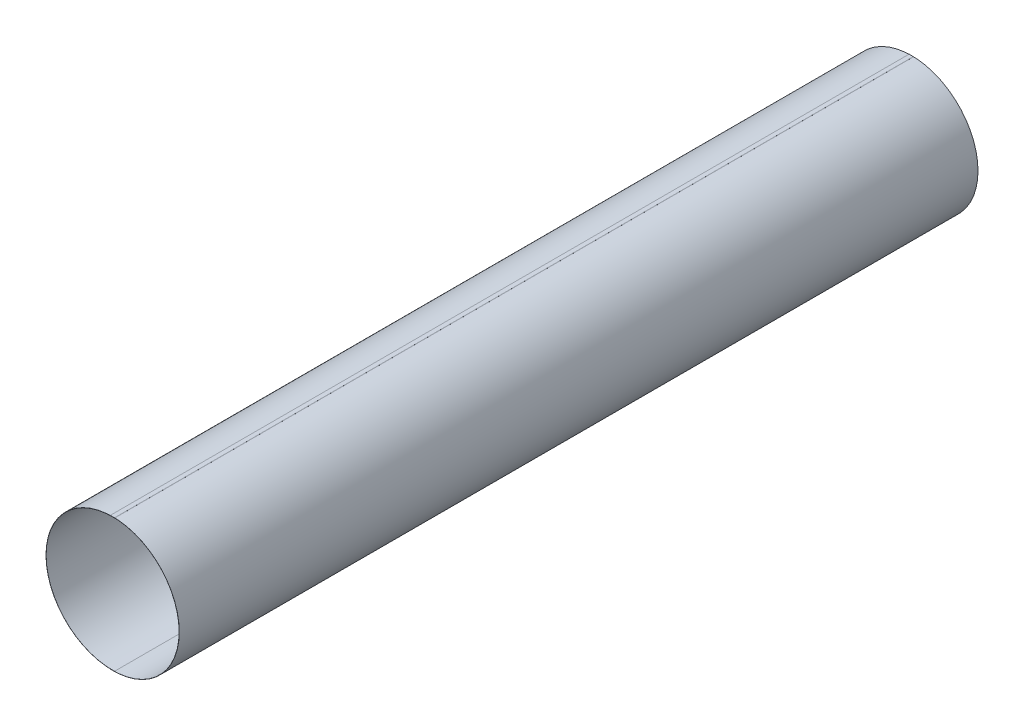
ISO-10303-21;
HEADER;
FILE_DESCRIPTION(('STEP AP214'),'2;1');
FILE_NAME('part.step','',(''),(''),'','','');
FILE_SCHEMA(('AUTOMOTIVE_DESIGN { 1 0 10303 214 1 1 1 1 }'));
ENDSEC;
DATA;
#1=APPLICATION_CONTEXT('core data for automotive mechanical design processes');
#2=APPLICATION_PROTOCOL_DEFINITION('international standard','automotive_design',2000,#1);
#3=PRODUCT_CONTEXT('',#1,'mechanical');
#4=PRODUCT('Part','Part','',(#3));
#5=PRODUCT_RELATED_PRODUCT_CATEGORY('part','',(#4));
#6=PRODUCT_DEFINITION_FORMATION('','',#4);
#7=PRODUCT_DEFINITION_CONTEXT('part definition',#1,'design');
#8=PRODUCT_DEFINITION('design','',#6,#7);
#9=PRODUCT_DEFINITION_SHAPE('','',#8);
#10=(LENGTH_UNIT() NAMED_UNIT(*) SI_UNIT(.MILLI.,.METRE.));
#11=(NAMED_UNIT(*) PLANE_ANGLE_UNIT() SI_UNIT($,.RADIAN.));
#12=(NAMED_UNIT(*) SI_UNIT($,.STERADIAN.) SOLID_ANGLE_UNIT());
#13=UNCERTAINTY_MEASURE_WITH_UNIT(LENGTH_MEASURE(1.E-05),#10,'distance_accuracy_value','');
#14=(GEOMETRIC_REPRESENTATION_CONTEXT(3) GLOBAL_UNCERTAINTY_ASSIGNED_CONTEXT((#13)) GLOBAL_UNIT_ASSIGNED_CONTEXT((#10,
#11,#12)) REPRESENTATION_CONTEXT('',''));
#15=CARTESIAN_POINT('',(0.,0.,0.));
#16=DIRECTION('',(0.,0.,1.));
#17=DIRECTION('',(1.,0.,0.));
#18=AXIS2_PLACEMENT_3D('',#15,#16,#17);
#19=CARTESIAN_POINT('',(0.,0.,1828.8));
#20=DIRECTION('',(0.,0.,-1.));
#21=DIRECTION('',(-1.,0.,0.));
#22=AXIS2_PLACEMENT_3D('',#19,#20,#21);
#23=CYLINDRICAL_SURFACE('',#22,152.654);
#24=CARTESIAN_POINT('',(0.,0.,0.));
#25=DIRECTION('',(0.,0.,1.));
#26=DIRECTION('',(0.,1.,0.));
#27=AXIS2_PLACEMENT_3D('',#24,#25,#26);
#28=CIRCLE('',#27,152.654);
#29=CARTESIAN_POINT('',(-5.00833333333342,-152.571820180603,0.));
#30=VERTEX_POINT('',#29);
#31=CARTESIAN_POINT('',(-5.00833333333339,152.571820180603,0.));
#32=VERTEX_POINT('',#31);
#33=EDGE_CURVE('E115',#30,#32,#28,.T.);
#34=ORIENTED_EDGE('',*,*,#33,.T.);
#35=DIRECTION('',(0.,0.,-1.));
#36=VECTOR('',#35,1.);
#37=CARTESIAN_POINT('',(-5.00833333333339,152.571820180603,1828.8));
#38=LINE('',#37,#36);
#39=CARTESIAN_POINT('',(-5.00833333333339,152.571820180603,1828.8));
#40=VERTEX_POINT('',#39);
#41=EDGE_CURVE('E12',#40,#32,#38,.T.);
#42=ORIENTED_EDGE('',*,*,#41,.F.);
#43=CARTESIAN_POINT('',(0.,0.,1828.8));
#44=DIRECTION('',(0.,0.,1.));
#45=DIRECTION('',(0.,1.,0.));
#46=AXIS2_PLACEMENT_3D('',#43,#44,#45);
#47=CIRCLE('',#46,152.654);
#48=CARTESIAN_POINT('',(-5.00833333333342,-152.571820180603,1828.8));
#49=VERTEX_POINT('',#48);
#50=EDGE_CURVE('E90',#49,#40,#47,.T.);
#51=ORIENTED_EDGE('',*,*,#50,.F.);
#52=DIRECTION('',(0.,0.,-1.));
#53=VECTOR('',#52,1.);
#54=CARTESIAN_POINT('',(-5.00833333333342,-152.571820180603,1828.8));
#55=LINE('',#54,#53);
#56=EDGE_CURVE('E65',#49,#30,#55,.T.);
#57=ORIENTED_EDGE('',*,*,#56,.T.);
#58=EDGE_LOOP('',(#34,#42,#51,#57));
#59=FACE_BOUND('',#58,.T.);
#60=ADVANCED_FACE('F47',(#59),#23,.T.);
#61=CARTESIAN_POINT('',(-5.00000000000005,152.317956919071,1828.8));
#62=DIRECTION('',(-0.999461659573957,-0.0328083989501339,0.));
#63=DIRECTION('',(0.0328083989501339,-0.999461659573957,0.));
#64=AXIS2_PLACEMENT_3D('',#61,#62,#63);
#65=PLANE('',#64);
#66=DIRECTION('',(-0.0328083989501339,0.999461659573957,0.));
#67=VECTOR('',#66,1.);
#68=CARTESIAN_POINT('',(-5.00000000000005,152.317956919071,0.));
#69=LINE('',#68,#67);
#70=CARTESIAN_POINT('',(-5.00000000000005,152.317956919071,0.));
#71=VERTEX_POINT('',#70);
#72=EDGE_CURVE('E98',#71,#32,#69,.T.);
#73=ORIENTED_EDGE('',*,*,#72,.F.);
#74=DIRECTION('',(0.,0.,-1.));
#75=VECTOR('',#74,1.);
#76=CARTESIAN_POINT('',(-5.00000000000005,152.317956919071,1828.8));
#77=LINE('',#76,#75);
#78=CARTESIAN_POINT('',(-5.00000000000005,152.317956919071,1828.8));
#79=VERTEX_POINT('',#78);
#80=EDGE_CURVE('E60',#79,#71,#77,.T.);
#81=ORIENTED_EDGE('',*,*,#80,.F.);
#82=DIRECTION('',(-0.0328083989501339,0.999461659573957,0.));
#83=VECTOR('',#82,1.);
#84=CARTESIAN_POINT('',(-5.00000000000005,152.317956919071,1828.8));
#85=LINE('',#84,#83);
#86=EDGE_CURVE('E96',#79,#40,#85,.T.);
#87=ORIENTED_EDGE('',*,*,#86,.T.);
#88=ORIENTED_EDGE('',*,*,#41,.T.);
#89=EDGE_LOOP('',(#73,#81,#87,#88));
#90=FACE_BOUND('',#89,.T.);
#91=ADVANCED_FACE('F92',(#90),#65,.T.);
#92=CARTESIAN_POINT('',(0.,0.,1828.8));
#93=DIRECTION('',(0.,0.,-1.));
#94=DIRECTION('',(-1.,0.,0.));
#95=AXIS2_PLACEMENT_3D('',#92,#93,#94);
#96=CYLINDRICAL_SURFACE('',#95,152.4);
#97=CARTESIAN_POINT('',(0.,0.,0.));
#98=DIRECTION('',(0.,0.,1.));
#99=DIRECTION('',(1.,0.,0.));
#100=AXIS2_PLACEMENT_3D('',#97,#98,#99);
#101=CIRCLE('',#100,152.4);
#102=CARTESIAN_POINT('',(-5.00000000000009,-152.317956919071,0.));
#103=VERTEX_POINT('',#102);
#104=EDGE_CURVE('E113',#103,#71,#101,.T.);
#105=ORIENTED_EDGE('',*,*,#104,.F.);
#106=DIRECTION('',(0.,0.,-1.));
#107=VECTOR('',#106,1.);
#108=CARTESIAN_POINT('',(-5.00000000000009,-152.317956919071,1828.8));
#109=LINE('',#108,#107);
#110=CARTESIAN_POINT('',(-5.00000000000009,-152.317956919071,1828.8));
#111=VERTEX_POINT('',#110);
#112=EDGE_CURVE('E79',#111,#103,#109,.T.);
#113=ORIENTED_EDGE('',*,*,#112,.F.);
#114=CARTESIAN_POINT('',(0.,0.,1828.8));
#115=DIRECTION('',(0.,0.,1.));
#116=DIRECTION('',(1.,0.,0.));
#117=AXIS2_PLACEMENT_3D('',#114,#115,#116);
#118=CIRCLE('',#117,152.4);
#119=EDGE_CURVE('E102',#111,#79,#118,.T.);
#120=ORIENTED_EDGE('',*,*,#119,.T.);
#121=ORIENTED_EDGE('',*,*,#80,.T.);
#122=EDGE_LOOP('',(#105,#113,#120,#121));
#123=FACE_BOUND('',#122,.T.);
#124=ADVANCED_FACE('F106',(#123),#96,.F.);
#125=CARTESIAN_POINT('',(-5.00833333333342,-152.571820180603,1828.8));
#126=DIRECTION('',(-0.999461659573958,0.0328083989500964,0.));
#127=DIRECTION('',(-0.0328083989500964,-0.999461659573959,0.));
#128=AXIS2_PLACEMENT_3D('',#125,#126,#127);
#129=PLANE('',#128);
#130=DIRECTION('',(0.0328083989500964,0.999461659573958,0.));
#131=VECTOR('',#130,1.);
#132=CARTESIAN_POINT('',(-5.00833333333342,-152.571820180603,0.));
#133=LINE('',#132,#131);
#134=EDGE_CURVE('E117',#30,#103,#133,.T.);
#135=ORIENTED_EDGE('',*,*,#134,.F.);
#136=ORIENTED_EDGE('',*,*,#56,.F.);
#137=DIRECTION('',(0.0328083989500964,0.999461659573958,0.));
#138=VECTOR('',#137,1.);
#139=CARTESIAN_POINT('',(-5.00833333333342,-152.571820180603,1828.8));
#140=LINE('',#139,#138);
#141=EDGE_CURVE('E110',#49,#111,#140,.T.);
#142=ORIENTED_EDGE('',*,*,#141,.T.);
#143=ORIENTED_EDGE('',*,*,#112,.T.);
#144=EDGE_LOOP('',(#135,#136,#142,#143));
#145=FACE_BOUND('',#144,.T.);
#146=ADVANCED_FACE('F125',(#145),#129,.T.);
#147=CARTESIAN_POINT('',(0.,0.,1828.8));
#148=DIRECTION('',(0.,0.,1.));
#149=DIRECTION('',(0.,1.,0.));
#150=AXIS2_PLACEMENT_3D('',#147,#148,#149);
#151=PLANE('',#150);
#152=ORIENTED_EDGE('',*,*,#50,.T.);
#153=ORIENTED_EDGE('',*,*,#86,.F.);
#154=ORIENTED_EDGE('',*,*,#119,.F.);
#155=ORIENTED_EDGE('',*,*,#141,.F.);
#156=EDGE_LOOP('',(#152,#153,#154,#155));
#157=FACE_BOUND('',#156,.T.);
#158=ADVANCED_FACE('F103',(#157),#151,.T.);
#159=CARTESIAN_POINT('',(0.,0.,0.));
#160=DIRECTION('',(0.,0.,1.));
#161=DIRECTION('',(0.,1.,0.));
#162=AXIS2_PLACEMENT_3D('',#159,#160,#161);
#163=PLANE('',#162);
#164=ORIENTED_EDGE('',*,*,#33,.F.);
#165=ORIENTED_EDGE('',*,*,#134,.T.);
#166=ORIENTED_EDGE('',*,*,#104,.T.);
#167=ORIENTED_EDGE('',*,*,#72,.T.);
#168=EDGE_LOOP('',(#164,#165,#166,#167));
#169=FACE_BOUND('',#168,.T.);
#170=ADVANCED_FACE('F121',(#169),#163,.F.);
#171=CLOSED_SHELL('',(#60,#91,#124,#146,#158,#170));
#172=MANIFOLD_SOLID_BREP('B2',#171);
#173=CARTESIAN_POINT('',(0.,0.,1828.8));
#174=DIRECTION('',(0.,0.,-1.));
#175=DIRECTION('',(-1.,0.,0.));
#176=AXIS2_PLACEMENT_3D('',#173,#174,#175);
#177=CYLINDRICAL_SURFACE('',#176,152.146);
#178=CARTESIAN_POINT('',(0.,0.,0.));
#179=DIRECTION('',(0.,0.,1.));
#180=DIRECTION('',(0.,1.,0.));
#181=AXIS2_PLACEMENT_3D('',#178,#179,#180);
#182=CIRCLE('',#181,152.146);
#183=CARTESIAN_POINT('',(4.99166666666671,-152.064093657539,0.));
#184=VERTEX_POINT('',#183);
#185=CARTESIAN_POINT('',(4.99166666666677,152.064093657539,0.));
#186=VERTEX_POINT('',#185);
#187=EDGE_CURVE('E237',#184,#186,#182,.F.);
#188=ORIENTED_EDGE('',*,*,#187,.T.);
#189=DIRECTION('',(0.,0.,-1.));
#190=VECTOR('',#189,1.);
#191=CARTESIAN_POINT('',(4.99166666666677,152.064093657539,1828.8));
#192=LINE('',#191,#190);
#193=CARTESIAN_POINT('',(4.99166666666677,152.064093657539,1828.8));
#194=VERTEX_POINT('',#193);
#195=EDGE_CURVE('E50',#194,#186,#192,.T.);
#196=ORIENTED_EDGE('',*,*,#195,.F.);
#197=CARTESIAN_POINT('',(0.,0.,1828.8));
#198=DIRECTION('',(0.,0.,1.));
#199=DIRECTION('',(0.,1.,0.));
#200=AXIS2_PLACEMENT_3D('',#197,#198,#199);
#201=CIRCLE('',#200,152.146);
#202=CARTESIAN_POINT('',(4.99166666666671,-152.064093657539,1828.8));
#203=VERTEX_POINT('',#202);
#204=EDGE_CURVE('E213',#203,#194,#201,.F.);
#205=ORIENTED_EDGE('',*,*,#204,.F.);
#206=DIRECTION('',(0.,0.,-1.));
#207=VECTOR('',#206,1.);
#208=CARTESIAN_POINT('',(4.99166666666671,-152.064093657539,1828.8));
#209=LINE('',#208,#207);
#210=EDGE_CURVE('E188',#203,#184,#209,.T.);
#211=ORIENTED_EDGE('',*,*,#210,.T.);
#212=EDGE_LOOP('',(#188,#196,#205,#211));
#213=FACE_BOUND('',#212,.T.);
#214=ADVANCED_FACE('F174',(#213),#177,.F.);
#215=CARTESIAN_POINT('',(5.00000000000005,152.317956919071,1828.8));
#216=DIRECTION('',(0.999461659573963,-0.0328083989499497,0.));
#217=DIRECTION('',(0.0328083989499497,0.999461659573963,0.));
#218=AXIS2_PLACEMENT_3D('',#215,#216,#217);
#219=PLANE('',#218);
#220=DIRECTION('',(-0.0328083989499497,-0.999461659573963,0.));
#221=VECTOR('',#220,1.);
#222=CARTESIAN_POINT('',(5.00000000000005,152.317956919071,0.));
#223=LINE('',#222,#221);
#224=CARTESIAN_POINT('',(5.00000000000005,152.317956919071,0.));
#225=VERTEX_POINT('',#224);
#226=EDGE_CURVE('E225',#225,#186,#223,.T.);
#227=ORIENTED_EDGE('',*,*,#226,.F.);
#228=DIRECTION('',(0.,0.,-1.));
#229=VECTOR('',#228,1.);
#230=CARTESIAN_POINT('',(5.00000000000005,152.317956919071,1828.8));
#231=LINE('',#230,#229);
#232=CARTESIAN_POINT('',(5.00000000000005,152.317956919071,1828.8));
#233=VERTEX_POINT('',#232);
#234=EDGE_CURVE('E182',#233,#225,#231,.T.);
#235=ORIENTED_EDGE('',*,*,#234,.F.);
#236=DIRECTION('',(-0.0328083989499497,-0.999461659573963,0.));
#237=VECTOR('',#236,1.);
#238=CARTESIAN_POINT('',(5.00000000000005,152.317956919071,1828.8));
#239=LINE('',#238,#237);
#240=EDGE_CURVE('E219',#233,#194,#239,.T.);
#241=ORIENTED_EDGE('',*,*,#240,.T.);
#242=ORIENTED_EDGE('',*,*,#195,.T.);
#243=EDGE_LOOP('',(#227,#235,#241,#242));
#244=FACE_BOUND('',#243,.T.);
#245=ADVANCED_FACE('F218',(#244),#219,.T.);
#246=CARTESIAN_POINT('',(0.,0.,1828.8));
#247=DIRECTION('',(0.,0.,-1.));
#248=DIRECTION('',(-1.,0.,0.));
#249=AXIS2_PLACEMENT_3D('',#246,#247,#248);
#250=CYLINDRICAL_SURFACE('',#249,152.4);
#251=CARTESIAN_POINT('',(0.,0.,0.));
#252=DIRECTION('',(0.,0.,-1.));
#253=DIRECTION('',(-1.,0.,0.));
#254=AXIS2_PLACEMENT_3D('',#251,#252,#253);
#255=CIRCLE('',#254,152.4);
#256=CARTESIAN_POINT('',(5.00000000000009,-152.317956919071,0.));
#257=VERTEX_POINT('',#256);
#258=EDGE_CURVE('E239',#257,#225,#255,.T.);
#259=ORIENTED_EDGE('',*,*,#258,.F.);
#260=DIRECTION('',(0.,0.,-1.));
#261=VECTOR('',#260,1.);
#262=CARTESIAN_POINT('',(5.00000000000009,-152.317956919071,1828.8));
#263=LINE('',#262,#261);
#264=CARTESIAN_POINT('',(5.00000000000009,-152.317956919071,1828.8));
#265=VERTEX_POINT('',#264);
#266=EDGE_CURVE('E205',#265,#257,#263,.T.);
#267=ORIENTED_EDGE('',*,*,#266,.F.);
#268=CARTESIAN_POINT('',(0.,0.,1828.8));
#269=DIRECTION('',(0.,0.,-1.));
#270=DIRECTION('',(-1.,0.,0.));
#271=AXIS2_PLACEMENT_3D('',#268,#269,#270);
#272=CIRCLE('',#271,152.4);
#273=EDGE_CURVE('E229',#265,#233,#272,.T.);
#274=ORIENTED_EDGE('',*,*,#273,.T.);
#275=ORIENTED_EDGE('',*,*,#234,.T.);
#276=EDGE_LOOP('',(#259,#267,#274,#275));
#277=FACE_BOUND('',#276,.T.);
#278=ADVANCED_FACE('F230',(#277),#250,.T.);
#279=CARTESIAN_POINT('',(4.99166666666671,-152.064093657539,1828.8));
#280=DIRECTION('',(0.999461659573951,0.0328083989503147,0.));
#281=DIRECTION('',(-0.0328083989503147,0.999461659573951,0.));
#282=AXIS2_PLACEMENT_3D('',#279,#280,#281);
#283=PLANE('',#282);
#284=DIRECTION('',(0.0328083989503147,-0.999461659573951,0.));
#285=VECTOR('',#284,1.);
#286=CARTESIAN_POINT('',(4.99166666666671,-152.064093657539,0.));
#287=LINE('',#286,#285);
#288=EDGE_CURVE('E241',#184,#257,#287,.T.);
#289=ORIENTED_EDGE('',*,*,#288,.F.);
#290=ORIENTED_EDGE('',*,*,#210,.F.);
#291=DIRECTION('',(0.0328083989503147,-0.999461659573951,0.));
#292=VECTOR('',#291,1.);
#293=CARTESIAN_POINT('',(4.99166666666671,-152.064093657539,1828.8));
#294=LINE('',#293,#292);
#295=EDGE_CURVE('E234',#203,#265,#294,.T.);
#296=ORIENTED_EDGE('',*,*,#295,.T.);
#297=ORIENTED_EDGE('',*,*,#266,.T.);
#298=EDGE_LOOP('',(#289,#290,#296,#297));
#299=FACE_BOUND('',#298,.T.);
#300=ADVANCED_FACE('F246',(#299),#283,.T.);
#301=CARTESIAN_POINT('',(0.,0.,1828.8));
#302=DIRECTION('',(0.,0.,1.));
#303=DIRECTION('',(0.,1.,0.));
#304=AXIS2_PLACEMENT_3D('',#301,#302,#303);
#305=PLANE('',#304);
#306=ORIENTED_EDGE('',*,*,#204,.T.);
#307=ORIENTED_EDGE('',*,*,#240,.F.);
#308=ORIENTED_EDGE('',*,*,#273,.F.);
#309=ORIENTED_EDGE('',*,*,#295,.F.);
#310=EDGE_LOOP('',(#306,#307,#308,#309));
#311=FACE_BOUND('',#310,.T.);
#312=ADVANCED_FACE('F227',(#311),#305,.T.);
#313=CARTESIAN_POINT('',(0.,0.,0.));
#314=DIRECTION('',(0.,0.,1.));
#315=DIRECTION('',(0.,1.,0.));
#316=AXIS2_PLACEMENT_3D('',#313,#314,#315);
#317=PLANE('',#316);
#318=ORIENTED_EDGE('',*,*,#187,.F.);
#319=ORIENTED_EDGE('',*,*,#288,.T.);
#320=ORIENTED_EDGE('',*,*,#258,.T.);
#321=ORIENTED_EDGE('',*,*,#226,.T.);
#322=EDGE_LOOP('',(#318,#319,#320,#321));
#323=FACE_BOUND('',#322,.T.);
#324=ADVANCED_FACE('F249',(#323),#317,.F.);
#325=CLOSED_SHELL('',(#214,#245,#278,#300,#312,#324));
#326=MANIFOLD_SOLID_BREP('B6',#325);
#327=ADVANCED_BREP_SHAPE_REPRESENTATION('',(#18,#172,#326),#14);
#328=SHAPE_DEFINITION_REPRESENTATION(#9,#327);
ENDSEC;
END-ISO-10303-21;
